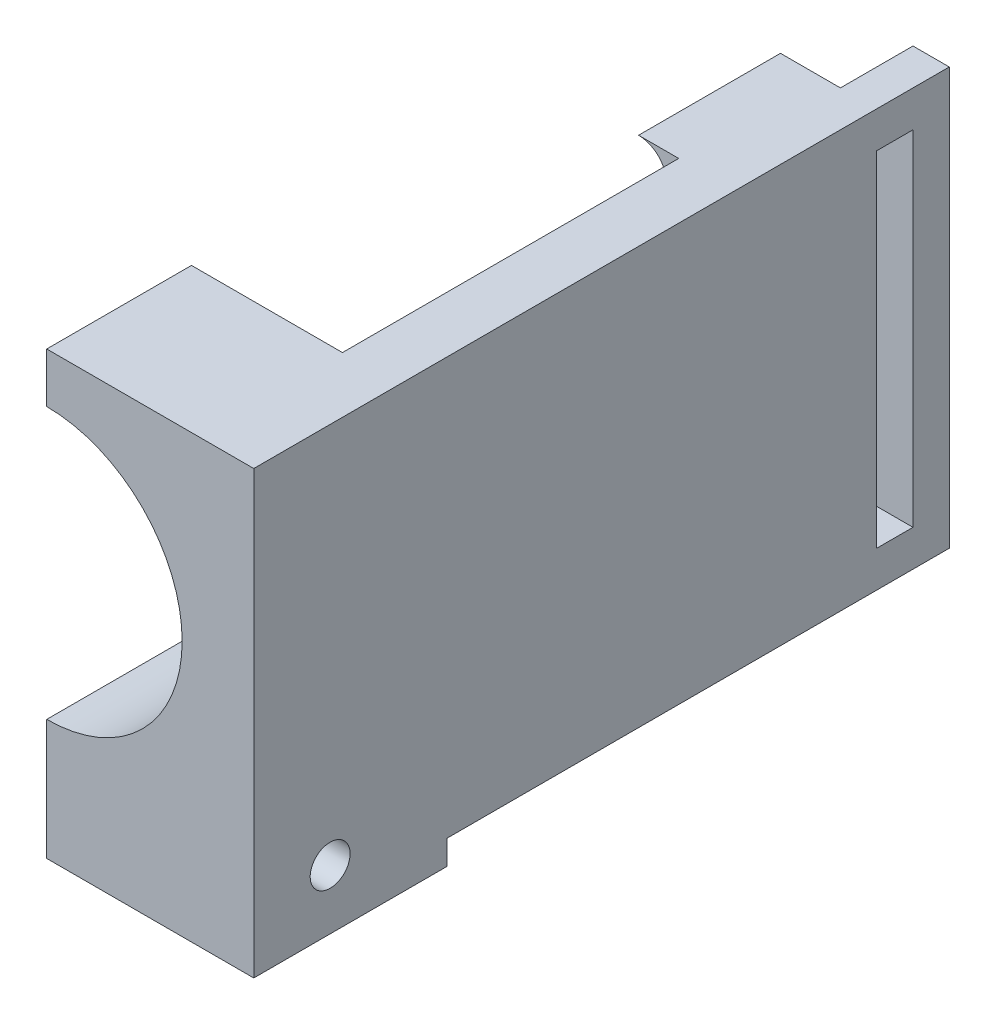
ISO-10303-21;
HEADER;
FILE_DESCRIPTION(('STEP AP214'),'2;1');
FILE_NAME('part.step','',(''),(''),'','','');
FILE_SCHEMA(('AUTOMOTIVE_DESIGN { 1 0 10303 214 1 1 1 1 }'));
ENDSEC;
DATA;
#1=APPLICATION_CONTEXT('core data for automotive mechanical design processes');
#2=APPLICATION_PROTOCOL_DEFINITION('international standard','automotive_design',2000,#1);
#3=PRODUCT_CONTEXT('',#1,'mechanical');
#4=PRODUCT('Part','Part','',(#3));
#5=PRODUCT_RELATED_PRODUCT_CATEGORY('part','',(#4));
#6=PRODUCT_DEFINITION_FORMATION('','',#4);
#7=PRODUCT_DEFINITION_CONTEXT('part definition',#1,'design');
#8=PRODUCT_DEFINITION('design','',#6,#7);
#9=PRODUCT_DEFINITION_SHAPE('','',#8);
#10=(LENGTH_UNIT() NAMED_UNIT(*) SI_UNIT(.MILLI.,.METRE.));
#11=(NAMED_UNIT(*) PLANE_ANGLE_UNIT() SI_UNIT($,.RADIAN.));
#12=(NAMED_UNIT(*) SI_UNIT($,.STERADIAN.) SOLID_ANGLE_UNIT());
#13=UNCERTAINTY_MEASURE_WITH_UNIT(LENGTH_MEASURE(1.E-05),#10,'distance_accuracy_value','');
#14=(GEOMETRIC_REPRESENTATION_CONTEXT(3) GLOBAL_UNCERTAINTY_ASSIGNED_CONTEXT((#13)) GLOBAL_UNIT_ASSIGNED_CONTEXT((#10,
#11,#12)) REPRESENTATION_CONTEXT('',''));
#15=CARTESIAN_POINT('',(0.,0.,0.));
#16=DIRECTION('',(0.,0.,1.));
#17=DIRECTION('',(1.,0.,0.));
#18=AXIS2_PLACEMENT_3D('',#15,#16,#17);
#19=CARTESIAN_POINT('',(-460.160074353057,126.931811763947,51.5000000000002));
#20=DIRECTION('',(1.,1.65860032904852E-13,0.));
#21=DIRECTION('',(0.,-1.17286680793131E-13,1.));
#22=AXIS2_PLACEMENT_3D('',#19,#20,#21);
#23=PLANE('',#22);
#24=CARTESIAN_POINT('',(-460.160074353052,95.3693467112426,45.1869886502198));
#25=DIRECTION('',(-1.,0.,0.));
#26=DIRECTION('',(0.,0.,1.));
#27=AXIS2_PLACEMENT_3D('',#24,#25,#26);
#28=CIRCLE('',#27,1.64999999999998);
#29=CARTESIAN_POINT('',(-460.160074353052,95.3693467112426,46.8369886502197));
#30=VERTEX_POINT('',#29);
#31=EDGE_CURVE('E261',#30,#30,#28,.T.);
#32=ORIENTED_EDGE('',*,*,#31,.T.);
#33=EDGE_LOOP('',(#32));
#34=FACE_BOUND('',#33,.T.);
#35=DIRECTION('',(0.,0.,-1.));
#36=VECTOR('',#35,1.);
#37=CARTESIAN_POINT('',(-460.160074353057,126.931811763947,51.5000000000002));
#38=LINE('',#37,#36);
#39=CARTESIAN_POINT('',(-460.160074353057,126.931811763947,51.5000000000002));
#40=VERTEX_POINT('',#39);
#41=CARTESIAN_POINT('',(-460.160074353057,126.931811763947,-6.));
#42=VERTEX_POINT('',#41);
#43=EDGE_CURVE('E597',#40,#42,#38,.T.);
#44=ORIENTED_EDGE('',*,*,#43,.F.);
#45=DIRECTION('',(-1.65860032904852E-13,1.,0.));
#46=VECTOR('',#45,1.);
#47=CARTESIAN_POINT('',(-460.160074353057,126.931811763947,51.5000000000002));
#48=LINE('',#47,#46);
#49=CARTESIAN_POINT('',(-460.160074353051,90.4528022039471,51.5000000000002));
#50=VERTEX_POINT('',#49);
#51=EDGE_CURVE('E602',#50,#40,#48,.T.);
#52=ORIENTED_EDGE('',*,*,#51,.F.);
#53=DIRECTION('',(0.,0.,-1.));
#54=VECTOR('',#53,1.);
#55=CARTESIAN_POINT('',(-460.160074353051,90.4528022039471,51.5000000000002));
#56=LINE('',#55,#54);
#57=CARTESIAN_POINT('',(-460.160074353051,90.4528022039471,35.5299999999876));
#58=VERTEX_POINT('',#57);
#59=EDGE_CURVE('E591',#50,#58,#56,.T.);
#60=ORIENTED_EDGE('',*,*,#59,.T.);
#61=DIRECTION('',(1.65860032904852E-13,-1.,0.));
#62=VECTOR('',#61,1.);
#63=CARTESIAN_POINT('',(-460.160074353057,126.931811763947,35.5299999999876));
#64=LINE('',#63,#62);
#65=CARTESIAN_POINT('',(-460.160074353052,92.4707569211926,35.5299999999876));
#66=VERTEX_POINT('',#65);
#67=EDGE_CURVE('E278',#66,#58,#64,.T.);
#68=ORIENTED_EDGE('',*,*,#67,.F.);
#69=DIRECTION('',(0.,0.,1.));
#70=VECTOR('',#69,1.);
#71=CARTESIAN_POINT('',(-460.160074353052,92.4707569211926,51.5000000000002));
#72=LINE('',#71,#70);
#73=CARTESIAN_POINT('',(-460.160074353057,92.4707569211926,-6.));
#74=VERTEX_POINT('',#73);
#75=EDGE_CURVE('E283',#74,#66,#72,.T.);
#76=ORIENTED_EDGE('',*,*,#75,.F.);
#77=DIRECTION('',(0.,-1.,0.));
#78=VECTOR('',#77,1.);
#79=CARTESIAN_POINT('',(-460.160074353057,126.931811763947,-6.));
#80=LINE('',#79,#78);
#81=EDGE_CURVE('E249',#42,#74,#80,.T.);
#82=ORIENTED_EDGE('',*,*,#81,.F.);
#83=EDGE_LOOP('',(#44,#52,#60,#68,#76,#82));
#84=FACE_BOUND('',#83,.T.);
#85=DIRECTION('',(1.65860032904852E-13,-1.,0.));
#86=VECTOR('',#85,1.);
#87=CARTESIAN_POINT('',(-460.160074353057,126.931811763947,-3.00000000000014));
#88=LINE('',#87,#86);
#89=CARTESIAN_POINT('',(-460.160074353055,123.931811763953,-3.00000000000013));
#90=VERTEX_POINT('',#89);
#91=CARTESIAN_POINT('',(-460.160074353052,95.4707569211974,-3.00000000000011));
#92=VERTEX_POINT('',#91);
#93=EDGE_CURVE('E226',#90,#92,#88,.T.);
#94=ORIENTED_EDGE('',*,*,#93,.T.);
#95=DIRECTION('',(0.,0.,1.));
#96=VECTOR('',#95,1.);
#97=CARTESIAN_POINT('',(-460.160074353052,95.4707569211984,51.5000000000002));
#98=LINE('',#97,#96);
#99=CARTESIAN_POINT('',(-460.160074353055,95.4707569211984,0.));
#100=VERTEX_POINT('',#99);
#101=EDGE_CURVE('E244',#92,#100,#98,.T.);
#102=ORIENTED_EDGE('',*,*,#101,.T.);
#103=DIRECTION('',(-1.65860032904852E-13,1.,0.));
#104=VECTOR('',#103,1.);
#105=CARTESIAN_POINT('',(-460.160074353057,126.931811763947,0.));
#106=LINE('',#105,#104);
#107=CARTESIAN_POINT('',(-460.160074353057,123.931811763953,0.));
#108=VERTEX_POINT('',#107);
#109=EDGE_CURVE('E242',#100,#108,#106,.T.);
#110=ORIENTED_EDGE('',*,*,#109,.T.);
#111=DIRECTION('',(0.,0.,-1.));
#112=VECTOR('',#111,1.);
#113=CARTESIAN_POINT('',(-460.160074353057,123.931811763953,51.5000000000002));
#114=LINE('',#113,#112);
#115=EDGE_CURVE('E231',#108,#90,#114,.T.);
#116=ORIENTED_EDGE('',*,*,#115,.T.);
#117=EDGE_LOOP('',(#94,#102,#110,#116));
#118=FACE_BOUND('',#117,.T.);
#119=ADVANCED_FACE('F33',(#34,#84,#118),#23,.T.);
#120=CARTESIAN_POINT('',(-463.160074353057,126.931811763947,-3.));
#121=DIRECTION('',(1.,0.,0.));
#122=DIRECTION('',(0.,0.,1.));
#123=AXIS2_PLACEMENT_3D('',#120,#121,#122);
#124=PLANE('',#123);
#125=DIRECTION('',(0.,0.,1.));
#126=VECTOR('',#125,1.);
#127=CARTESIAN_POINT('',(-463.160074353057,95.4707569211974,-2.99999999999997));
#128=LINE('',#127,#126);
#129=CARTESIAN_POINT('',(-463.160074353057,95.4707569211974,-3.0000000000001));
#130=VERTEX_POINT('',#129);
#131=CARTESIAN_POINT('',(-463.160074353057,95.4707569211974,0.));
#132=VERTEX_POINT('',#131);
#133=EDGE_CURVE('E11',#130,#132,#128,.T.);
#134=ORIENTED_EDGE('',*,*,#133,.F.);
#135=DIRECTION('',(0.,-1.,0.));
#136=VECTOR('',#135,1.);
#137=CARTESIAN_POINT('',(-463.160074353057,126.931811763947,-3.00000000000012));
#138=LINE('',#137,#136);
#139=CARTESIAN_POINT('',(-463.160074353057,123.931811763953,-3.00000000000012));
#140=VERTEX_POINT('',#139);
#141=EDGE_CURVE('E624',#140,#130,#138,.T.);
#142=ORIENTED_EDGE('',*,*,#141,.F.);
#143=DIRECTION('',(0.,0.,-1.));
#144=VECTOR('',#143,1.);
#145=CARTESIAN_POINT('',(-463.160074353057,123.931811763952,-3.));
#146=LINE('',#145,#144);
#147=CARTESIAN_POINT('',(-463.160074353057,123.931811763952,0.));
#148=VERTEX_POINT('',#147);
#149=EDGE_CURVE('E41',#148,#140,#146,.T.);
#150=ORIENTED_EDGE('',*,*,#149,.F.);
#151=DIRECTION('',(0.,-1.,0.));
#152=VECTOR('',#151,1.);
#153=CARTESIAN_POINT('',(-463.160074353057,126.931811763947,0.));
#154=LINE('',#153,#152);
#155=CARTESIAN_POINT('',(-463.160074353057,126.931811763947,0.));
#156=VERTEX_POINT('',#155);
#157=EDGE_CURVE('E268',#156,#148,#154,.T.);
#158=ORIENTED_EDGE('',*,*,#157,.F.);
#159=DIRECTION('',(0.,0.,1.));
#160=VECTOR('',#159,1.);
#161=CARTESIAN_POINT('',(-463.160074353057,126.931811763947,-3.));
#162=LINE('',#161,#160);
#163=CARTESIAN_POINT('',(-463.160074353057,126.931811763947,-6.));
#164=VERTEX_POINT('',#163);
#165=EDGE_CURVE('E274',#164,#156,#162,.T.);
#166=ORIENTED_EDGE('',*,*,#165,.F.);
#167=DIRECTION('',(0.,1.,0.));
#168=VECTOR('',#167,1.);
#169=CARTESIAN_POINT('',(-463.160074353057,126.931811763947,-6.));
#170=LINE('',#169,#168);
#171=CARTESIAN_POINT('',(-463.160074353057,92.4707569211926,-6.));
#172=VERTEX_POINT('',#171);
#173=EDGE_CURVE('E255',#172,#164,#170,.T.);
#174=ORIENTED_EDGE('',*,*,#173,.F.);
#175=DIRECTION('',(0.,0.,1.));
#176=VECTOR('',#175,1.);
#177=CARTESIAN_POINT('',(-463.160074353057,92.4707569211926,-3.));
#178=LINE('',#177,#176);
#179=CARTESIAN_POINT('',(-463.160074353057,92.4707569211926,0.));
#180=VERTEX_POINT('',#179);
#181=EDGE_CURVE('E271',#172,#180,#178,.T.);
#182=ORIENTED_EDGE('',*,*,#181,.T.);
#183=EDGE_CURVE('E267',#132,#180,#154,.T.);
#184=ORIENTED_EDGE('',*,*,#183,.F.);
#185=EDGE_LOOP('',(#134,#142,#150,#158,#166,#174,#182,#184));
#186=FACE_BOUND('',#185,.T.);
#187=ADVANCED_FACE('F566',(#186),#124,.F.);
#188=CARTESIAN_POINT('',(-477.276554498702,90.4528022039443,51.5000000000002));
#189=DIRECTION('',(1.66137197891333E-13,-1.,0.));
#190=DIRECTION('',(0.707106781186546,1.17364610913999E-13,0.707106781186549));
#191=AXIS2_PLACEMENT_3D('',#188,#189,#190);
#192=PLANE('',#191);
#193=ORIENTED_EDGE('',*,*,#59,.F.);
#194=DIRECTION('',(1.,1.66137197891333E-13,0.));
#195=VECTOR('',#194,1.);
#196=CARTESIAN_POINT('',(-477.276554498702,90.4528022039443,51.5000000000002));
#197=LINE('',#196,#195);
#198=CARTESIAN_POINT('',(-477.276554498702,90.4528022039443,51.5000000000002));
#199=VERTEX_POINT('',#198);
#200=EDGE_CURVE('E594',#199,#50,#197,.T.);
#201=ORIENTED_EDGE('',*,*,#200,.F.);
#202=DIRECTION('',(0.,0.,-1.));
#203=VECTOR('',#202,1.);
#204=CARTESIAN_POINT('',(-477.276554498702,90.4528022039443,51.5000000000002));
#205=LINE('',#204,#203);
#206=CARTESIAN_POINT('',(-477.276554498703,90.4528022039452,35.5299999999983));
#207=VERTEX_POINT('',#206);
#208=EDGE_CURVE('E598',#199,#207,#205,.T.);
#209=ORIENTED_EDGE('',*,*,#208,.T.);
#210=DIRECTION('',(1.,1.66137197891333E-13,0.));
#211=VECTOR('',#210,1.);
#212=CARTESIAN_POINT('',(-477.276554498702,90.4528022039443,35.5299999999983));
#213=LINE('',#212,#211);
#214=EDGE_CURVE('E294',#207,#58,#213,.T.);
#215=ORIENTED_EDGE('',*,*,#214,.T.);
#216=EDGE_LOOP('',(#193,#201,#209,#215));
#217=FACE_BOUND('',#216,.T.);
#218=ADVANCED_FACE('F573',(#217),#192,.T.);
#219=CARTESIAN_POINT('',(-385.596308409067,-6.39582483758597E-11,0.));
#220=DIRECTION('',(0.,0.,-1.));
#221=DIRECTION('',(1.,0.,0.));
#222=AXIS2_PLACEMENT_3D('',#219,#220,#221);
#223=PLANE('',#222);
#224=CARTESIAN_POINT('',(-468.114796031957,126.931807047554,2.5951463200613E-12));
#225=CARTESIAN_POINT('',(-467.496068248431,126.932089161988,2.70616862252382E-12));
#226=CARTESIAN_POINT('',(-466.889577014183,126.677335876202,2.5951463200613E-12));
#227=CARTESIAN_POINT('',(-466.242380773724,126.028677898943,2.5951463200613E-12));
#228=CARTESIAN_POINT('',(-466.06872842055,125.768815773081,2.5951463200613E-12));
#229=CARTESIAN_POINT('',(-465.834017886216,125.201572162842,2.48412401759879E-12));
#230=CARTESIAN_POINT('',(-465.774089850333,124.897845916206,2.48412401759879E-12));
#231=CARTESIAN_POINT('',(-465.773877511361,124.588570288248,2.37310171513627E-12));
#232=B_SPLINE_CURVE_WITH_KNOTS('',3,(#224,#225,#226,#227,#228,#229,#230,#231),.UNSPECIFIED.,.F.,
.F.,(4,2,2,4),(0.,0.500000000000003,0.750000000000002,1.),.UNSPECIFIED.);
#233=CARTESIAN_POINT('',(-465.773877511361,124.588570288248,2.33146835171283E-12));
#234=VERTEX_POINT('',#233);
#235=CARTESIAN_POINT('',(-468.114796033842,126.931811073181,2.66453525910038E-12));
#236=VERTEX_POINT('',#235);
#237=EDGE_CURVE('E399',#234,#236,#232,.F.);
#238=ORIENTED_EDGE('',*,*,#237,.T.);
#239=DIRECTION('',(-1.,-1.65326412748026E-13,0.));
#240=VECTOR('',#239,1.);
#241=CARTESIAN_POINT('',(-477.276554498709,126.931811763944,1.11022302462516E-13));
#242=LINE('',#241,#240);
#243=EDGE_CURVE('E617',#156,#236,#242,.T.);
#244=ORIENTED_EDGE('',*,*,#243,.F.);
#245=ORIENTED_EDGE('',*,*,#157,.T.);
#246=DIRECTION('',(-1.,-3.31512595153072E-13,0.));
#247=VECTOR('',#246,1.);
#248=CARTESIAN_POINT('',(-460.143034644359,123.931811763953,0.));
#249=LINE('',#248,#247);
#250=EDGE_CURVE('E239',#108,#148,#249,.T.);
#251=ORIENTED_EDGE('',*,*,#250,.F.);
#252=ORIENTED_EDGE('',*,*,#109,.F.);
#253=DIRECTION('',(-1.,-3.31512595153072E-13,0.));
#254=VECTOR('',#253,1.);
#255=CARTESIAN_POINT('',(-460.143034644349,95.4707569211984,0.));
#256=LINE('',#255,#254);
#257=EDGE_CURVE('E232',#100,#132,#256,.T.);
#258=ORIENTED_EDGE('',*,*,#257,.T.);
#259=ORIENTED_EDGE('',*,*,#183,.T.);
#260=DIRECTION('',(1.,0.,0.));
#261=VECTOR('',#260,1.);
#262=CARTESIAN_POINT('',(-385.596308409067,92.4707569211926,0.));
#263=LINE('',#262,#261);
#264=CARTESIAN_POINT('',(-465.773934445629,92.4707569211926,-1.68136313739523E-12));
#265=VERTEX_POINT('',#264);
#266=EDGE_CURVE('E281',#265,#180,#263,.T.);
#267=ORIENTED_EDGE('',*,*,#266,.F.);
#268=DIRECTION('',(4.88753547251991E-06,0.999999999988056,1.20051202729928E-13));
#269=VECTOR('',#268,1.);
#270=CARTESIAN_POINT('',(-465.773934445629,92.4707569211975,-1.4432899320127E-12));
#271=LINE('',#270,#269);
#272=CARTESIAN_POINT('',(-465.773875573204,104.516178530985,1.11022302462516E-13));
#273=VERTEX_POINT('',#272);
#274=EDGE_CURVE('E390',#265,#273,#271,.T.);
#275=ORIENTED_EDGE('',*,*,#274,.T.);
#276=CARTESIAN_POINT('',(-465.56864967198,105.332450282229,1.31838984174237E-13));
#277=CARTESIAN_POINT('',(-465.70324918756,105.082078518386,0.));
#278=CARTESIAN_POINT('',(-465.774208517554,104.800492867988,1.31838984174237E-13));
#279=CARTESIAN_POINT('',(-465.773875573204,104.516178530985,1.31838984174237E-13));
#280=B_SPLINE_CURVE_WITH_KNOTS('',3,(#276,#277,#278,#279),.UNSPECIFIED.,.F.,.F.,(4,4),(0.,
0.999999867875692),.UNSPECIFIED.);
#281=CARTESIAN_POINT('',(-465.568651340804,105.33245105015,2.22044604925031E-13));
#282=VERTEX_POINT('',#281);
#283=EDGE_CURVE('E349',#273,#282,#280,.F.);
#284=ORIENTED_EDGE('',*,*,#283,.T.);
#285=CARTESIAN_POINT('',(-477.278580840851,111.609532937297,8.88178419700125E-13));
#286=DIRECTION('',(0.,-1.17977477392766E-13,1.));
#287=DIRECTION('',(1.,0.,0.));
#288=AXIS2_PLACEMENT_3D('',#285,#286,#287);
#289=CIRCLE('',#288,13.2862412259458);
#290=CARTESIAN_POINT('',(-465.569102668922,117.88745465771,1.66533453693773E-12));
#291=VERTEX_POINT('',#290);
#292=EDGE_CURVE('E446',#282,#291,#289,.T.);
#293=ORIENTED_EDGE('',*,*,#292,.T.);
#294=CARTESIAN_POINT('',(-465.773872780228,118.703841708333,1.67227343084164E-12));
#295=CARTESIAN_POINT('',(-465.774215138043,118.419582861066,1.56125112837913E-12));
#296=CARTESIAN_POINT('',(-465.703720404201,118.137880252078,1.67227343084164E-12));
#297=CARTESIAN_POINT('',(-465.569102668922,117.88745465771,1.67227343084164E-12));
#298=B_SPLINE_CURVE_WITH_KNOTS('',3,(#294,#295,#296,#297),.UNSPECIFIED.,.F.,.F.,(4,4),(0.,
0.999999910707361),.UNSPECIFIED.);
#299=CARTESIAN_POINT('',(-465.773873365884,118.703841632796,1.66533453693773E-12));
#300=VERTEX_POINT('',#299);
#301=EDGE_CURVE('E410',#291,#300,#298,.F.);
#302=ORIENTED_EDGE('',*,*,#301,.T.);
#303=DIRECTION('',(-7.04446682593713E-07,0.999999999999752,1.11628015828976E-13));
#304=VECTOR('',#303,1.);
#305=CARTESIAN_POINT('',(-465.773873365884,118.703841632796,1.66533453693773E-12));
#306=LINE('',#305,#304);
#307=CARTESIAN_POINT('',(-465.773874091199,119.733466311507,5.55111512312578E-13));
#308=VERTEX_POINT('',#307);
#309=EDGE_CURVE('E409',#300,#308,#306,.T.);
#310=ORIENTED_EDGE('',*,*,#309,.T.);
#311=DIRECTION('',(-1.,-1.66000787408614E-13,0.));
#312=VECTOR('',#311,1.);
#313=CARTESIAN_POINT('',(-464.297413987431,119.733466311507,4.44089209850063E-13));
#314=LINE('',#313,#312);
#315=CARTESIAN_POINT('',(-464.297413987431,119.733466311507,4.44089209850063E-13));
#316=VERTEX_POINT('',#315);
#317=EDGE_CURVE('E335',#316,#308,#314,.T.);
#318=ORIENTED_EDGE('',*,*,#317,.F.);
#319=DIRECTION('',(-1.66000787408614E-13,1.,0.));
#320=VECTOR('',#319,1.);
#321=CARTESIAN_POINT('',(-464.297413987431,119.733466311507,4.44089209850063E-13));
#322=LINE('',#321,#320);
#323=CARTESIAN_POINT('',(-464.297413987432,122.933466311507,0.));
#324=VERTEX_POINT('',#323);
#325=EDGE_CURVE('E343',#316,#324,#322,.T.);
#326=ORIENTED_EDGE('',*,*,#325,.T.);
#327=DIRECTION('',(-1.,-1.66000787408614E-13,0.));
#328=VECTOR('',#327,1.);
#329=CARTESIAN_POINT('',(-490.297413987432,122.933466311503,5.55111512312578E-13));
#330=LINE('',#329,#328);
#331=CARTESIAN_POINT('',(-465.773876345429,122.933466311507,4.44089209850063E-13));
#332=VERTEX_POINT('',#331);
#333=EDGE_CURVE('E319',#324,#332,#330,.T.);
#334=ORIENTED_EDGE('',*,*,#333,.T.);
#335=EDGE_CURVE('E405',#332,#234,#306,.T.);
#336=ORIENTED_EDGE('',*,*,#335,.T.);
#337=EDGE_LOOP('',(#238,#244,#245,#251,#252,#258,#259,#267,#275,#284,#293,#302,#310,#318,#326,
#334,#336));
#338=FACE_BOUND('',#337,.T.);
#339=ADVANCED_FACE('F580',(#338),#223,.T.);
#340=CARTESIAN_POINT('',(-465.773873365884,118.703841632792,39.5331100000017));
#341=DIRECTION('',(0.999999999999752,7.04446682593713E-07,0.));
#342=DIRECTION('',(0.,-1.17286680793131E-13,1.));
#343=AXIS2_PLACEMENT_3D('',#340,#341,#342);
#344=PLANE('',#343);
#345=DIRECTION('',(0.,0.,-1.));
#346=VECTOR('',#345,1.);
#347=CARTESIAN_POINT('',(-465.773875639816,121.931811763946,39.5331100000017));
#348=LINE('',#347,#346);
#349=CARTESIAN_POINT('',(-465.773875639816,121.931811763946,39.5331100000027));
#350=VERTEX_POINT('',#349);
#351=CARTESIAN_POINT('',(-465.773875394426,121.931811763946,13.0000000000004));
#352=VERTEX_POINT('',#351);
#353=EDGE_CURVE('E316',#350,#352,#348,.T.);
#354=ORIENTED_EDGE('',*,*,#353,.T.);
#355=DIRECTION('',(7.04446682593713E-07,-0.999999999999752,0.));
#356=VECTOR('',#355,1.);
#357=CARTESIAN_POINT('',(-465.773873365884,118.703841632792,13.0000000000005));
#358=LINE('',#357,#356);
#359=CARTESIAN_POINT('',(-465.773874091199,119.733466311507,13.0000000000005));
#360=VERTEX_POINT('',#359);
#361=EDGE_CURVE('E352',#352,#360,#358,.T.);
#362=ORIENTED_EDGE('',*,*,#361,.T.);
#363=DIRECTION('',(0.,0.,1.));
#364=VECTOR('',#363,1.);
#365=CARTESIAN_POINT('',(-465.773874091199,119.733466311507,39.5331100000018));
#366=LINE('',#365,#364);
#367=EDGE_CURVE('E346',#308,#360,#366,.T.);
#368=ORIENTED_EDGE('',*,*,#367,.F.);
#369=ORIENTED_EDGE('',*,*,#309,.F.);
#370=DIRECTION('',(0.,1.17977477392766E-13,-1.));
#371=VECTOR('',#370,1.);
#372=CARTESIAN_POINT('',(-465.773873365884,118.703841632792,39.5331100000017));
#373=LINE('',#372,#371);
#374=CARTESIAN_POINT('',(-465.773873365884,118.703841632792,39.5331100000017));
#375=VERTEX_POINT('',#374);
#376=EDGE_CURVE('E473',#375,#300,#373,.T.);
#377=ORIENTED_EDGE('',*,*,#376,.F.);
#378=DIRECTION('',(-7.04446682593713E-07,0.999999999999752,1.11628015828976E-13));
#379=VECTOR('',#378,1.);
#380=CARTESIAN_POINT('',(-465.773873365884,118.703841632792,39.5331100000017));
#381=LINE('',#380,#379);
#382=EDGE_CURVE('E466',#375,#350,#381,.T.);
#383=ORIENTED_EDGE('',*,*,#382,.T.);
#384=EDGE_LOOP('',(#354,#362,#368,#369,#377,#383));
#385=FACE_BOUND('',#384,.T.);
#386=ADVANCED_FACE('F586',(#385),#344,.F.);
#387=CARTESIAN_POINT('',(-477.276554498708,126.931811763944,51.5000000000002));
#388=DIRECTION('',(-1.,-1.65860032904852E-13,0.));
#389=DIRECTION('',(0.,1.17286680793131E-13,-1.));
#390=AXIS2_PLACEMENT_3D('',#387,#388,#389);
#391=PLANE('',#390);
#392=DIRECTION('',(0.,0.,-1.));
#393=VECTOR('',#392,1.);
#394=CARTESIAN_POINT('',(-477.276554498708,122.80775275393,90.4341100000001));
#395=LINE('',#394,#393);
#396=CARTESIAN_POINT('',(-477.276554498708,122.80775275393,51.5));
#397=VERTEX_POINT('',#396);
#398=CARTESIAN_POINT('',(-477.276554498708,122.80775275393,39.5331100000001));
#399=VERTEX_POINT('',#398);
#400=EDGE_CURVE('E908',#397,#399,#395,.T.);
#401=ORIENTED_EDGE('',*,*,#400,.F.);
#402=DIRECTION('',(1.65860032904852E-13,-1.,0.));
#403=VECTOR('',#402,1.);
#404=CARTESIAN_POINT('',(-477.276554498708,126.931811763944,51.5000000000002));
#405=LINE('',#404,#403);
#406=CARTESIAN_POINT('',(-477.276554498708,126.931811763944,51.5000000000002));
#407=VERTEX_POINT('',#406);
#408=EDGE_CURVE('E608',#407,#397,#405,.T.);
#409=ORIENTED_EDGE('',*,*,#408,.F.);
#410=DIRECTION('',(0.,0.,-1.));
#411=VECTOR('',#410,1.);
#412=CARTESIAN_POINT('',(-477.276554498708,126.931811763944,51.5000000000002));
#413=LINE('',#412,#411);
#414=CARTESIAN_POINT('',(-477.276554498708,126.93181176394,39.5331100000027));
#415=VERTEX_POINT('',#414);
#416=EDGE_CURVE('E614',#407,#415,#413,.T.);
#417=ORIENTED_EDGE('',*,*,#416,.T.);
#418=DIRECTION('',(-1.65860032904852E-13,1.,0.));
#419=VECTOR('',#418,1.);
#420=CARTESIAN_POINT('',(-477.276554498708,126.931811763944,39.53311));
#421=LINE('',#420,#419);
#422=EDGE_CURVE('E900',#399,#415,#421,.T.);
#423=ORIENTED_EDGE('',*,*,#422,.F.);
#424=EDGE_LOOP('',(#401,#409,#417,#423));
#425=FACE_BOUND('',#424,.T.);
#426=ADVANCED_FACE('F828',(#425),#391,.T.);
#427=CARTESIAN_POINT('',(-477.276554498708,126.931811763944,51.5000000000002));
#428=DIRECTION('',(-1.65326412748026E-13,1.,0.));
#429=DIRECTION('',(-0.707106781186546,-1.16791299241081E-13,-0.707106781186549));
#430=AXIS2_PLACEMENT_3D('',#427,#428,#429);
#431=PLANE('',#430);
#432=DIRECTION('',(-1.,-1.67202262744753E-13,0.));
#433=VECTOR('',#432,1.);
#434=CARTESIAN_POINT('',(-468.114796033843,126.931811763946,39.5331100000027));
#435=LINE('',#434,#433);
#436=CARTESIAN_POINT('',(-464.794796033843,126.931811763946,39.5331100000027));
#437=VERTEX_POINT('',#436);
#438=CARTESIAN_POINT('',(-468.114796033843,126.931811763946,39.5331100000027));
#439=VERTEX_POINT('',#438);
#440=EDGE_CURVE('E300',#437,#439,#435,.T.);
#441=ORIENTED_EDGE('',*,*,#440,.T.);
#442=DIRECTION('',(-0.999999999999997,7.5396397891137E-08,0.));
#443=VECTOR('',#442,1.);
#444=CARTESIAN_POINT('',(-468.114796033843,126.931811073176,39.5331100000027));
#445=LINE('',#444,#443);
#446=EDGE_CURVE('E519',#439,#415,#445,.T.);
#447=ORIENTED_EDGE('',*,*,#446,.T.);
#448=ORIENTED_EDGE('',*,*,#416,.F.);
#449=DIRECTION('',(-1.,-1.65326412748026E-13,0.));
#450=VECTOR('',#449,1.);
#451=CARTESIAN_POINT('',(-477.276554498708,126.931811763944,51.5000000000002));
#452=LINE('',#451,#450);
#453=EDGE_CURVE('E605',#40,#407,#452,.T.);
#454=ORIENTED_EDGE('',*,*,#453,.F.);
#455=ORIENTED_EDGE('',*,*,#43,.T.);
#456=DIRECTION('',(1.,0.,0.));
#457=VECTOR('',#456,1.);
#458=CARTESIAN_POINT('',(-460.160074353057,126.931811763947,-6.));
#459=LINE('',#458,#457);
#460=EDGE_CURVE('E258',#164,#42,#459,.T.);
#461=ORIENTED_EDGE('',*,*,#460,.F.);
#462=ORIENTED_EDGE('',*,*,#165,.T.);
#463=ORIENTED_EDGE('',*,*,#243,.T.);
#464=DIRECTION('',(0.,1.17977477392766E-13,-1.));
#465=VECTOR('',#464,1.);
#466=CARTESIAN_POINT('',(-468.114796033843,126.931811073176,39.5331100000027));
#467=LINE('',#466,#465);
#468=CARTESIAN_POINT('',(-468.114796033843,126.931811763946,11.7331100000027));
#469=VERTEX_POINT('',#468);
#470=EDGE_CURVE('E479',#469,#236,#467,.T.);
#471=ORIENTED_EDGE('',*,*,#470,.F.);
#472=DIRECTION('',(1.,1.58842149607515E-13,0.));
#473=VECTOR('',#472,1.);
#474=CARTESIAN_POINT('',(-468.114796033843,126.931811763946,11.7331100000027));
#475=LINE('',#474,#473);
#476=CARTESIAN_POINT('',(-464.794796033843,126.931811763946,11.7331100000027));
#477=VERTEX_POINT('',#476);
#478=EDGE_CURVE('E296',#469,#477,#475,.T.);
#479=ORIENTED_EDGE('',*,*,#478,.T.);
#480=DIRECTION('',(0.,0.,1.));
#481=VECTOR('',#480,1.);
#482=CARTESIAN_POINT('',(-464.794796033843,126.931811763946,39.5331100000027));
#483=LINE('',#482,#481);
#484=EDGE_CURVE('E303',#477,#437,#483,.T.);
#485=ORIENTED_EDGE('',*,*,#484,.T.);
#486=EDGE_LOOP('',(#441,#447,#448,#454,#455,#461,#462,#463,#471,#479,#485));
#487=FACE_BOUND('',#486,.T.);
#488=ADVANCED_FACE('F578',(#487),#431,.T.);
#489=CARTESIAN_POINT('',(-477.276554498703,95.3693467112426,45.1869886502198));
#490=DIRECTION('',(1.,1.65860032904852E-13,0.));
#491=DIRECTION('',(1.65860032904852E-13,-1.,0.));
#492=AXIS2_PLACEMENT_3D('',#489,#490,#491);
#493=CIRCLE('',#492,1.64999999999999);
#494=CARTESIAN_POINT('',(-477.276554498703,93.7193467112426,45.1869886502198));
#495=VERTEX_POINT('',#494);
#496=EDGE_CURVE('E264',#495,#495,#493,.T.);
#497=ORIENTED_EDGE('',*,*,#496,.T.);
#498=EDGE_LOOP('',(#497));
#499=FACE_BOUND('',#498,.T.);
#500=DIRECTION('',(0.,1.,1.17977477392766E-13));
#501=VECTOR('',#500,1.);
#502=CARTESIAN_POINT('',(-477.276554498702,80.1307569211926,35.5299999999971));
#503=LINE('',#502,#501);
#504=CARTESIAN_POINT('',(-477.276554498703,92.4707569211926,35.5299999999986));
#505=VERTEX_POINT('',#504);
#506=EDGE_CURVE('E291',#207,#505,#503,.T.);
#507=ORIENTED_EDGE('',*,*,#506,.F.);
#508=ORIENTED_EDGE('',*,*,#208,.F.);
#509=CARTESIAN_POINT('',(-477.276554498704,100.411313120601,51.5));
#510=VERTEX_POINT('',#509);
#511=EDGE_CURVE('E620',#510,#199,#405,.T.);
#512=ORIENTED_EDGE('',*,*,#511,.F.);
#513=DIRECTION('',(0.,0.,-1.));
#514=VECTOR('',#513,1.);
#515=CARTESIAN_POINT('',(-477.276554498704,100.411313120601,90.4341100000001));
#516=LINE('',#515,#514);
#517=CARTESIAN_POINT('',(-477.276554498704,100.411313120601,39.5331100000001));
#518=VERTEX_POINT('',#517);
#519=EDGE_CURVE('E911',#518,#510,#516,.F.);
#520=ORIENTED_EDGE('',*,*,#519,.F.);
#521=CARTESIAN_POINT('',(-477.276554498705,92.4707569211921,39.5331099999986));
#522=VERTEX_POINT('',#521);
#523=EDGE_CURVE('E621',#522,#518,#421,.T.);
#524=ORIENTED_EDGE('',*,*,#523,.F.);
#525=DIRECTION('',(0.,1.17977477392766E-13,-1.));
#526=VECTOR('',#525,1.);
#527=CARTESIAN_POINT('',(-477.276554498703,92.4707569211907,51.4999999999961));
#528=LINE('',#527,#526);
#529=EDGE_CURVE('E404',#522,#505,#528,.T.);
#530=ORIENTED_EDGE('',*,*,#529,.T.);
#531=EDGE_LOOP('',(#507,#508,#512,#520,#524,#530));
#532=FACE_BOUND('',#531,.T.);
#533=ADVANCED_FACE('F35',(#499,#532),#391,.T.);
#534=CARTESIAN_POINT('',(-385.596308409067,-6.39664149056565E-11,51.5));
#535=DIRECTION('',(0.,0.,-1.));
#536=DIRECTION('',(1.,0.,0.));
#537=AXIS2_PLACEMENT_3D('',#534,#535,#536);
#538=PLANE('',#537);
#539=CARTESIAN_POINT('',(-477.278580840852,111.609532937265,51.5));
#540=DIRECTION('',(0.,0.,1.));
#541=DIRECTION('',(1.,0.,0.));
#542=AXIS2_PLACEMENT_3D('',#539,#540,#541);
#543=CIRCLE('',#542,11.19822);
#544=EDGE_CURVE('E635',#397,#510,#543,.F.);
#545=ORIENTED_EDGE('',*,*,#544,.T.);
#546=ORIENTED_EDGE('',*,*,#511,.T.);
#547=ORIENTED_EDGE('',*,*,#200,.T.);
#548=ORIENTED_EDGE('',*,*,#51,.T.);
#549=ORIENTED_EDGE('',*,*,#453,.T.);
#550=ORIENTED_EDGE('',*,*,#408,.T.);
#551=EDGE_LOOP('',(#545,#546,#547,#548,#549,#550));
#552=FACE_BOUND('',#551,.T.);
#553=ADVANCED_FACE('F372',(#552),#538,.F.);
#554=CARTESIAN_POINT('',(-465.773875573204,104.516178530981,39.5331100000001));
#555=CARTESIAN_POINT('',(-465.774208517554,104.800492867983,39.5331100000001));
#556=CARTESIAN_POINT('',(-465.70324918756,105.082078518381,39.53311));
#557=CARTESIAN_POINT('',(-465.56864967198,105.332450282224,39.5331100000001));
#558=B_SPLINE_CURVE_WITH_KNOTS('',3,(#554,#555,#556,#557),.UNSPECIFIED.,.F.,.F.,(4,4),(0.,
0.999999867875692),.UNSPECIFIED.);
#559=DIRECTION('',(0.,1.17977477392766E-13,-1.));
#560=VECTOR('',#559,1.);
#561=SURFACE_OF_LINEAR_EXTRUSION('',#558,#560);
#562=ORIENTED_EDGE('',*,*,#283,.F.);
#563=DIRECTION('',(0.,1.17977477392766E-13,-1.));
#564=VECTOR('',#563,1.);
#565=CARTESIAN_POINT('',(-465.773875573204,104.516178530981,39.5331100000001));
#566=LINE('',#565,#564);
#567=CARTESIAN_POINT('',(-465.773875573204,104.516178530981,39.5331100000001));
#568=VERTEX_POINT('',#567);
#569=EDGE_CURVE('E353',#568,#273,#566,.T.);
#570=ORIENTED_EDGE('',*,*,#569,.F.);
#571=CARTESIAN_POINT('',(-465.773875573204,104.516178530981,39.5331100000001));
#572=CARTESIAN_POINT('',(-465.774208517554,104.800492867983,39.5331100000001));
#573=CARTESIAN_POINT('',(-465.70324918756,105.082078518381,39.53311));
#574=CARTESIAN_POINT('',(-465.56864967198,105.332450282224,39.5331100000001));
#575=B_SPLINE_CURVE_WITH_KNOTS('',3,(#571,#572,#573,#574),.UNSPECIFIED.,.F.,.F.,(4,4),(0.,
0.999999867875692),.UNSPECIFIED.);
#576=CARTESIAN_POINT('',(-465.568651340804,105.332451050145,39.5331100000001));
#577=VERTEX_POINT('',#576);
#578=EDGE_CURVE('E398',#568,#577,#575,.T.);
#579=ORIENTED_EDGE('',*,*,#578,.T.);
#580=DIRECTION('',(0.,1.17977477392766E-13,-1.));
#581=VECTOR('',#580,1.);
#582=CARTESIAN_POINT('',(-465.568651340804,105.332451050145,39.5331100000001));
#583=LINE('',#582,#581);
#584=EDGE_CURVE('E459',#577,#282,#583,.T.);
#585=ORIENTED_EDGE('',*,*,#584,.T.);
#586=EDGE_LOOP('',(#562,#570,#579,#585));
#587=FACE_BOUND('',#586,.T.);
#588=ADVANCED_FACE('F366',(#587),#561,.T.);
#589=CARTESIAN_POINT('',(-465.773934445629,92.4707569211928,39.5331099999986));
#590=DIRECTION('',(0.999999999988056,-4.88753547251991E-06,0.));
#591=DIRECTION('',(0.,-1.17286680793131E-13,1.));
#592=AXIS2_PLACEMENT_3D('',#589,#590,#591);
#593=PLANE('',#592);
#594=ORIENTED_EDGE('',*,*,#274,.F.);
#595=DIRECTION('',(0.,-1.17959243398817E-13,1.));
#596=VECTOR('',#595,1.);
#597=CARTESIAN_POINT('',(-465.773934445629,92.4707569211975,-1.44328993201262E-12));
#598=LINE('',#597,#596);
#599=CARTESIAN_POINT('',(-465.773934445629,92.4707569211933,35.5299999999986));
#600=VERTEX_POINT('',#599);
#601=EDGE_CURVE('E286',#265,#600,#598,.T.);
#602=ORIENTED_EDGE('',*,*,#601,.T.);
#603=DIRECTION('',(0.,1.17977477392766E-13,-1.));
#604=VECTOR('',#603,1.);
#605=CARTESIAN_POINT('',(-465.773934445629,92.4707569211928,39.5331099999986));
#606=LINE('',#605,#604);
#607=CARTESIAN_POINT('',(-465.773934445629,92.4707569211928,39.5331099999986));
#608=VERTEX_POINT('',#607);
#609=EDGE_CURVE('E510',#608,#600,#606,.T.);
#610=ORIENTED_EDGE('',*,*,#609,.F.);
#611=DIRECTION('',(4.88753547251991E-06,0.999999999988056,1.20051202729928E-13));
#612=VECTOR('',#611,1.);
#613=CARTESIAN_POINT('',(-465.773934445629,92.4707569211928,39.5331099999986));
#614=LINE('',#613,#612);
#615=EDGE_CURVE('E481',#608,#568,#614,.T.);
#616=ORIENTED_EDGE('',*,*,#615,.T.);
#617=ORIENTED_EDGE('',*,*,#569,.T.);
#618=EDGE_LOOP('',(#594,#602,#610,#616,#617));
#619=FACE_BOUND('',#618,.T.);
#620=ADVANCED_FACE('F371',(#619),#593,.F.);
#621=CARTESIAN_POINT('',(-488.783227184468,92.4707569211914,39.5331099999986));
#622=DIRECTION('',(0.,-1.,-1.17977477392766E-13));
#623=DIRECTION('',(-0.707106781186549,-1.27176204571094E-13,0.707106781186546));
#624=AXIS2_PLACEMENT_3D('',#621,#622,#623);
#625=PLANE('',#624);
#626=ORIENTED_EDGE('',*,*,#529,.F.);
#627=DIRECTION('',(1.,0.,0.));
#628=VECTOR('',#627,1.);
#629=CARTESIAN_POINT('',(-488.783227184468,92.4707569211914,39.5331099999986));
#630=LINE('',#629,#628);
#631=EDGE_CURVE('E514',#522,#608,#630,.T.);
#632=ORIENTED_EDGE('',*,*,#631,.T.);
#633=ORIENTED_EDGE('',*,*,#609,.T.);
#634=DIRECTION('',(-1.,0.,0.));
#635=VECTOR('',#634,1.);
#636=CARTESIAN_POINT('',(-477.276554498703,92.4707569211926,35.5299999999986));
#637=LINE('',#636,#635);
#638=EDGE_CURVE('E289',#600,#505,#637,.T.);
#639=ORIENTED_EDGE('',*,*,#638,.T.);
#640=EDGE_LOOP('',(#626,#632,#633,#639));
#641=FACE_BOUND('',#640,.T.);
#642=ADVANCED_FACE('F560',(#641),#625,.F.);
#643=CARTESIAN_POINT('',(-465.773877511361,124.588570288244,39.5331100000024));
#644=CARTESIAN_POINT('',(-465.774089850333,124.897845916202,39.5331100000025));
#645=CARTESIAN_POINT('',(-465.834017886216,125.201572162838,39.5331100000025));
#646=CARTESIAN_POINT('',(-466.06872842055,125.768815773076,39.5331100000026));
#647=CARTESIAN_POINT('',(-466.242380773724,126.028677898938,39.5331100000026));
#648=CARTESIAN_POINT('',(-466.889577014183,126.677335876197,39.5331100000026));
#649=CARTESIAN_POINT('',(-467.496068248431,126.932089161983,39.5331100000027));
#650=CARTESIAN_POINT('',(-468.114796031957,126.931807047549,39.5331100000026));
#651=B_SPLINE_CURVE_WITH_KNOTS('',3,(#643,#644,#645,#646,#647,#648,#649,#650),.UNSPECIFIED.,.F.,
.F.,(4,2,2,4),(0.,0.249999999999998,0.499999999999997,1.),.UNSPECIFIED.);
#652=DIRECTION('',(0.,1.17977477392766E-13,-1.));
#653=VECTOR('',#652,1.);
#654=SURFACE_OF_LINEAR_EXTRUSION('',#651,#653);
#655=ORIENTED_EDGE('',*,*,#470,.T.);
#656=ORIENTED_EDGE('',*,*,#237,.F.);
#657=DIRECTION('',(0.,1.17977477392766E-13,-1.));
#658=VECTOR('',#657,1.);
#659=CARTESIAN_POINT('',(-465.773877511361,124.588570288244,39.5331100000024));
#660=LINE('',#659,#658);
#661=CARTESIAN_POINT('',(-465.773877511361,124.588570288247,11.7331100000027));
#662=VERTEX_POINT('',#661);
#663=EDGE_CURVE('E474',#662,#234,#660,.T.);
#664=ORIENTED_EDGE('',*,*,#663,.F.);
#665=CARTESIAN_POINT('',(-465.773877511361,124.588570288247,11.733110000003));
#666=CARTESIAN_POINT('',(-465.774089850333,124.897845916205,11.7331100000031));
#667=CARTESIAN_POINT('',(-465.834017886216,125.201572162841,11.7331100000031));
#668=CARTESIAN_POINT('',(-466.06872842055,125.768815773079,11.7331100000032));
#669=CARTESIAN_POINT('',(-466.242380773724,126.028677898942,11.7331100000032));
#670=CARTESIAN_POINT('',(-466.889577014183,126.6773358762,11.7331100000032));
#671=CARTESIAN_POINT('',(-467.496068248431,126.932089161986,11.7331100000033));
#672=CARTESIAN_POINT('',(-468.114796031957,126.931807047552,11.7331100000032));
#673=B_SPLINE_CURVE_WITH_KNOTS('',3,(#665,#666,#667,#668,#669,#670,#671,#672),.UNSPECIFIED.,.F.,
.F.,(4,2,2,4),(0.,0.249999999999998,0.499999999999997,1.),.UNSPECIFIED.);
#674=EDGE_CURVE('E312',#469,#662,#673,.F.);
#675=ORIENTED_EDGE('',*,*,#674,.F.);
#676=EDGE_LOOP('',(#655,#656,#664,#675));
#677=FACE_BOUND('',#676,.T.);
#678=ADVANCED_FACE('F552',(#677),#654,.T.);
#679=ORIENTED_EDGE('',*,*,#663,.T.);
#680=ORIENTED_EDGE('',*,*,#335,.F.);
#681=DIRECTION('',(0.,0.,-1.));
#682=VECTOR('',#681,1.);
#683=CARTESIAN_POINT('',(-465.773876345429,122.933466311507,39.5331100000017));
#684=LINE('',#683,#682);
#685=CARTESIAN_POINT('',(-465.773876345429,122.933466311507,11.7331100000027));
#686=VERTEX_POINT('',#685);
#687=EDGE_CURVE('E331',#686,#332,#684,.T.);
#688=ORIENTED_EDGE('',*,*,#687,.F.);
#689=DIRECTION('',(7.04446682593713E-07,-0.999999999999752,0.));
#690=VECTOR('',#689,1.);
#691=CARTESIAN_POINT('',(-465.773873365884,118.703841632792,11.7331100000027));
#692=LINE('',#691,#690);
#693=EDGE_CURVE('E308',#662,#686,#692,.T.);
#694=ORIENTED_EDGE('',*,*,#693,.F.);
#695=EDGE_LOOP('',(#679,#680,#688,#694));
#696=FACE_BOUND('',#695,.T.);
#697=ADVANCED_FACE('F436',(#696),#344,.F.);
#698=CARTESIAN_POINT('',(-465.569102668922,117.887454657706,39.5331100000017));
#699=CARTESIAN_POINT('',(-465.703720404201,118.137880252073,39.5331100000017));
#700=CARTESIAN_POINT('',(-465.774215138043,118.419582861061,39.5331100000016));
#701=CARTESIAN_POINT('',(-465.773872780228,118.703841708328,39.5331100000017));
#702=B_SPLINE_CURVE_WITH_KNOTS('',3,(#698,#699,#700,#701),.UNSPECIFIED.,.F.,.F.,(4,4),(0.,
0.999999910707361),.UNSPECIFIED.);
#703=DIRECTION('',(0.,1.17977477392766E-13,-1.));
#704=VECTOR('',#703,1.);
#705=SURFACE_OF_LINEAR_EXTRUSION('',#702,#704);
#706=ORIENTED_EDGE('',*,*,#301,.F.);
#707=DIRECTION('',(0.,1.17977477392766E-13,-1.));
#708=VECTOR('',#707,1.);
#709=CARTESIAN_POINT('',(-465.569102668922,117.887454657706,39.5331100000017));
#710=LINE('',#709,#708);
#711=CARTESIAN_POINT('',(-465.569102668922,117.887454657706,39.5331100000017));
#712=VERTEX_POINT('',#711);
#713=EDGE_CURVE('E475',#712,#291,#710,.T.);
#714=ORIENTED_EDGE('',*,*,#713,.F.);
#715=CARTESIAN_POINT('',(-465.569102668922,117.887454657706,39.5331100000017));
#716=CARTESIAN_POINT('',(-465.703720404201,118.137880252073,39.5331100000017));
#717=CARTESIAN_POINT('',(-465.774215138043,118.419582861061,39.5331100000016));
#718=CARTESIAN_POINT('',(-465.773872780228,118.703841708328,39.5331100000017));
#719=B_SPLINE_CURVE_WITH_KNOTS('',3,(#715,#716,#717,#718),.UNSPECIFIED.,.F.,.F.,(4,4),(0.,
0.999999910707361),.UNSPECIFIED.);
#720=EDGE_CURVE('E421',#712,#375,#719,.T.);
#721=ORIENTED_EDGE('',*,*,#720,.T.);
#722=ORIENTED_EDGE('',*,*,#376,.T.);
#723=EDGE_LOOP('',(#706,#714,#721,#722));
#724=FACE_BOUND('',#723,.T.);
#725=ADVANCED_FACE('F427',(#724),#705,.T.);
#726=CARTESIAN_POINT('',(-477.278580840851,111.609532937292,39.5331100000008));
#727=DIRECTION('',(0.,1.17977477392766E-13,-1.));
#728=DIRECTION('',(1.,0.,0.));
#729=AXIS2_PLACEMENT_3D('',#726,#727,#728);
#730=CYLINDRICAL_SURFACE('',#729,13.2862412259458);
#731=ORIENTED_EDGE('',*,*,#292,.F.);
#732=ORIENTED_EDGE('',*,*,#584,.F.);
#733=CARTESIAN_POINT('',(-477.278580840851,111.609532937292,39.5331100000008));
#734=DIRECTION('',(0.,-1.17977477392766E-13,1.));
#735=DIRECTION('',(1.,0.,0.));
#736=AXIS2_PLACEMENT_3D('',#733,#734,#735);
#737=CIRCLE('',#736,13.2862412259458);
#738=EDGE_CURVE('E463',#577,#712,#737,.T.);
#739=ORIENTED_EDGE('',*,*,#738,.T.);
#740=ORIENTED_EDGE('',*,*,#713,.T.);
#741=EDGE_LOOP('',(#731,#732,#739,#740));
#742=FACE_BOUND('',#741,.T.);
#743=ADVANCED_FACE('F374',(#742),#730,.F.);
#744=CARTESIAN_POINT('',(-465.721862295066,104.937042871537,39.53311));
#745=DIRECTION('',(0.,0.,-1.));
#746=DIRECTION('',(1.,0.,0.));
#747=AXIS2_PLACEMENT_3D('',#744,#745,#746);
#748=PLANE('',#747);
#749=ORIENTED_EDGE('',*,*,#440,.F.);
#750=DIRECTION('',(-1.65326412748026E-13,1.,0.));
#751=VECTOR('',#750,1.);
#752=CARTESIAN_POINT('',(-464.794796033842,121.931811763946,39.5331100000027));
#753=LINE('',#752,#751);
#754=CARTESIAN_POINT('',(-464.794796033842,121.931811763946,39.5331100000027));
#755=VERTEX_POINT('',#754);
#756=EDGE_CURVE('E306',#755,#437,#753,.T.);
#757=ORIENTED_EDGE('',*,*,#756,.F.);
#758=DIRECTION('',(-1.,-1.67202262744753E-13,0.));
#759=VECTOR('',#758,1.);
#760=CARTESIAN_POINT('',(-468.114796033842,121.931811763946,39.5331100000027));
#761=LINE('',#760,#759);
#762=EDGE_CURVE('E299',#755,#350,#761,.T.);
#763=ORIENTED_EDGE('',*,*,#762,.T.);
#764=ORIENTED_EDGE('',*,*,#382,.F.);
#765=ORIENTED_EDGE('',*,*,#720,.F.);
#766=ORIENTED_EDGE('',*,*,#738,.F.);
#767=ORIENTED_EDGE('',*,*,#578,.F.);
#768=ORIENTED_EDGE('',*,*,#615,.F.);
#769=ORIENTED_EDGE('',*,*,#631,.F.);
#770=ORIENTED_EDGE('',*,*,#523,.T.);
#771=CARTESIAN_POINT('',(-477.278580840852,111.609532937265,39.5331100000001));
#772=DIRECTION('',(0.,0.,-1.));
#773=DIRECTION('',(-1.,0.,0.));
#774=AXIS2_PLACEMENT_3D('',#771,#772,#773);
#775=CIRCLE('',#774,11.19822);
#776=EDGE_CURVE('E350',#399,#518,#775,.T.);
#777=ORIENTED_EDGE('',*,*,#776,.F.);
#778=ORIENTED_EDGE('',*,*,#422,.T.);
#779=ORIENTED_EDGE('',*,*,#446,.F.);
#780=EDGE_LOOP('',(#749,#757,#763,#764,#765,#766,#767,#768,#769,#770,#777,#778,#779));
#781=FACE_BOUND('',#780,.T.);
#782=ADVANCED_FACE('F486',(#781),#748,.T.);
#783=CARTESIAN_POINT('',(-477.278580840852,111.609532937265,90.4341100000001));
#784=DIRECTION('',(0.,0.,-1.));
#785=DIRECTION('',(1.,0.,0.));
#786=AXIS2_PLACEMENT_3D('',#783,#784,#785);
#787=CYLINDRICAL_SURFACE('',#786,11.19822);
#788=ORIENTED_EDGE('',*,*,#776,.T.);
#789=ORIENTED_EDGE('',*,*,#519,.T.);
#790=ORIENTED_EDGE('',*,*,#544,.F.);
#791=ORIENTED_EDGE('',*,*,#400,.T.);
#792=EDGE_LOOP('',(#788,#789,#790,#791));
#793=FACE_BOUND('',#792,.T.);
#794=ADVANCED_FACE('F496',(#793),#787,.F.);
#795=CARTESIAN_POINT('',(-464.297413987431,119.733466311507,13.0000000000005));
#796=DIRECTION('',(-1.,-1.66000787408614E-13,0.));
#797=DIRECTION('',(0.,1.17286680793131E-13,-1.));
#798=AXIS2_PLACEMENT_3D('',#795,#796,#797);
#799=PLANE('',#798);
#800=DIRECTION('',(-1.66000787408614E-13,1.,0.));
#801=VECTOR('',#800,1.);
#802=CARTESIAN_POINT('',(-464.297413987431,119.733466311507,13.0000000000005));
#803=LINE('',#802,#801);
#804=CARTESIAN_POINT('',(-464.297413987431,119.733466311507,13.0000000000005));
#805=VERTEX_POINT('',#804);
#806=CARTESIAN_POINT('',(-464.297413987432,122.933466311507,13.0000000000005));
#807=VERTEX_POINT('',#806);
#808=EDGE_CURVE('E340',#805,#807,#803,.T.);
#809=ORIENTED_EDGE('',*,*,#808,.T.);
#810=DIRECTION('',(0.,0.,-1.));
#811=VECTOR('',#810,1.);
#812=CARTESIAN_POINT('',(-464.297413987432,122.933466311507,13.0000000000005));
#813=LINE('',#812,#811);
#814=EDGE_CURVE('E327',#807,#324,#813,.T.);
#815=ORIENTED_EDGE('',*,*,#814,.T.);
#816=ORIENTED_EDGE('',*,*,#325,.F.);
#817=DIRECTION('',(0.,0.,-1.));
#818=VECTOR('',#817,1.);
#819=CARTESIAN_POINT('',(-464.297413987431,119.733466311507,13.0000000000005));
#820=LINE('',#819,#818);
#821=EDGE_CURVE('E333',#805,#316,#820,.T.);
#822=ORIENTED_EDGE('',*,*,#821,.F.);
#823=EDGE_LOOP('',(#809,#815,#816,#822));
#824=FACE_BOUND('',#823,.T.);
#825=ADVANCED_FACE('F697',(#824),#799,.T.);
#826=CARTESIAN_POINT('',(-385.596308409087,119.73346631152,545.3155289531));
#827=DIRECTION('',(1.66000787408614E-13,-1.,0.));
#828=DIRECTION('',(0.707106781186546,1.1672495877943E-13,0.707106781186549));
#829=AXIS2_PLACEMENT_3D('',#826,#827,#828);
#830=PLANE('',#829);
#831=ORIENTED_EDGE('',*,*,#317,.T.);
#832=ORIENTED_EDGE('',*,*,#367,.T.);
#833=DIRECTION('',(1.,1.66000787408614E-13,0.));
#834=VECTOR('',#833,1.);
#835=CARTESIAN_POINT('',(-490.297413987431,119.733466311503,13.0000000000005));
#836=LINE('',#835,#834);
#837=EDGE_CURVE('E338',#360,#805,#836,.T.);
#838=ORIENTED_EDGE('',*,*,#837,.T.);
#839=ORIENTED_EDGE('',*,*,#821,.T.);
#840=EDGE_LOOP('',(#831,#832,#838,#839));
#841=FACE_BOUND('',#840,.T.);
#842=ADVANCED_FACE('F706',(#841),#830,.F.);
#843=CARTESIAN_POINT('',(-490.297413987431,119.733466311503,13.0000000000005));
#844=DIRECTION('',(0.,0.,-1.));
#845=DIRECTION('',(1.,0.,0.));
#846=AXIS2_PLACEMENT_3D('',#843,#844,#845);
#847=PLANE('',#846);
#848=DIRECTION('',(-1.65326412748026E-13,1.,0.));
#849=VECTOR('',#848,1.);
#850=CARTESIAN_POINT('',(-464.794796033841,119.733466311507,13.0000000000004));
#851=LINE('',#850,#849);
#852=CARTESIAN_POINT('',(-464.794796033842,121.931811763946,13.0000000000004));
#853=VERTEX_POINT('',#852);
#854=CARTESIAN_POINT('',(-464.794796033842,122.933466311507,13.0000000000005));
#855=VERTEX_POINT('',#854);
#856=EDGE_CURVE('E313',#853,#855,#851,.T.);
#857=ORIENTED_EDGE('',*,*,#856,.T.);
#858=DIRECTION('',(-1.,-1.66000787408614E-13,0.));
#859=VECTOR('',#858,1.);
#860=CARTESIAN_POINT('',(-490.297413987432,122.933466311503,13.0000000000006));
#861=LINE('',#860,#859);
#862=EDGE_CURVE('E324',#807,#855,#861,.T.);
#863=ORIENTED_EDGE('',*,*,#862,.F.);
#864=ORIENTED_EDGE('',*,*,#808,.F.);
#865=ORIENTED_EDGE('',*,*,#837,.F.);
#866=ORIENTED_EDGE('',*,*,#361,.F.);
#867=DIRECTION('',(-1.,-1.58842149607515E-13,0.));
#868=VECTOR('',#867,1.);
#869=CARTESIAN_POINT('',(-490.297413987431,121.931811763942,13.0000000000005));
#870=LINE('',#869,#868);
#871=EDGE_CURVE('E537',#853,#352,#870,.T.);
#872=ORIENTED_EDGE('',*,*,#871,.F.);
#873=EDGE_LOOP('',(#857,#863,#864,#865,#866,#872));
#874=FACE_BOUND('',#873,.T.);
#875=ADVANCED_FACE('F714',(#874),#847,.T.);
#876=CARTESIAN_POINT('',(-490.297413987432,122.933466311503,13.0000000000006));
#877=DIRECTION('',(-1.66000787408614E-13,1.,0.));
#878=DIRECTION('',(-0.707106781186546,-1.17268154136643E-13,-0.707106781186549));
#879=AXIS2_PLACEMENT_3D('',#876,#877,#878);
#880=PLANE('',#879);
#881=DIRECTION('',(1.,1.66000787408614E-13,0.));
#882=VECTOR('',#881,1.);
#883=CARTESIAN_POINT('',(-490.297413987432,122.933466311503,11.7331100000027));
#884=LINE('',#883,#882);
#885=CARTESIAN_POINT('',(-464.794796033842,122.933466311507,11.7331100000027));
#886=VERTEX_POINT('',#885);
#887=EDGE_CURVE('E630',#686,#886,#884,.T.);
#888=ORIENTED_EDGE('',*,*,#887,.F.);
#889=ORIENTED_EDGE('',*,*,#687,.T.);
#890=ORIENTED_EDGE('',*,*,#333,.F.);
#891=ORIENTED_EDGE('',*,*,#814,.F.);
#892=ORIENTED_EDGE('',*,*,#862,.T.);
#893=DIRECTION('',(0.,0.,1.));
#894=VECTOR('',#893,1.);
#895=CARTESIAN_POINT('',(-464.794796033842,122.933466311507,13.0000000000006));
#896=LINE('',#895,#894);
#897=EDGE_CURVE('E625',#886,#855,#896,.T.);
#898=ORIENTED_EDGE('',*,*,#897,.F.);
#899=EDGE_LOOP('',(#888,#889,#890,#891,#892,#898));
#900=FACE_BOUND('',#899,.T.);
#901=ADVANCED_FACE('F725',(#900),#880,.F.);
#902=CARTESIAN_POINT('',(-1.93354897704333E-11,121.93181176402,1.2593610782961E-13));
#903=DIRECTION('',(-1.58842149607515E-13,1.,0.));
#904=DIRECTION('',(-1.,-1.58842149607515E-13,0.));
#905=AXIS2_PLACEMENT_3D('',#902,#903,#904);
#906=PLANE('',#905);
#907=ORIENTED_EDGE('',*,*,#353,.F.);
#908=ORIENTED_EDGE('',*,*,#762,.F.);
#909=DIRECTION('',(0.,0.,1.));
#910=VECTOR('',#909,1.);
#911=CARTESIAN_POINT('',(-464.794796033842,121.931811763946,39.5331100000027));
#912=LINE('',#911,#910);
#913=EDGE_CURVE('E297',#853,#755,#912,.T.);
#914=ORIENTED_EDGE('',*,*,#913,.F.);
#915=ORIENTED_EDGE('',*,*,#871,.T.);
#916=EDGE_LOOP('',(#907,#908,#914,#915));
#917=FACE_BOUND('',#916,.T.);
#918=ADVANCED_FACE('F733',(#917),#906,.T.);
#919=CARTESIAN_POINT('',(-468.114796033842,121.931811763946,11.7331100000027));
#920=DIRECTION('',(0.,0.,-1.));
#921=DIRECTION('',(0.,-1.,0.));
#922=AXIS2_PLACEMENT_3D('',#919,#920,#921);
#923=PLANE('',#922);
#924=ORIENTED_EDGE('',*,*,#478,.F.);
#925=ORIENTED_EDGE('',*,*,#674,.T.);
#926=ORIENTED_EDGE('',*,*,#693,.T.);
#927=ORIENTED_EDGE('',*,*,#887,.T.);
#928=DIRECTION('',(-1.65326412748026E-13,1.,0.));
#929=VECTOR('',#928,1.);
#930=CARTESIAN_POINT('',(-464.794796033842,121.931811763946,11.7331100000027));
#931=LINE('',#930,#929);
#932=EDGE_CURVE('E302',#886,#477,#931,.T.);
#933=ORIENTED_EDGE('',*,*,#932,.T.);
#934=EDGE_LOOP('',(#924,#925,#926,#927,#933));
#935=FACE_BOUND('',#934,.T.);
#936=ADVANCED_FACE('F743',(#935),#923,.F.);
#937=CARTESIAN_POINT('',(-464.794796033842,121.931811763946,39.5331100000027));
#938=DIRECTION('',(1.,1.65326412748026E-13,0.));
#939=DIRECTION('',(-1.65326412748026E-13,1.,0.));
#940=AXIS2_PLACEMENT_3D('',#937,#938,#939);
#941=PLANE('',#940);
#942=ORIENTED_EDGE('',*,*,#856,.F.);
#943=ORIENTED_EDGE('',*,*,#913,.T.);
#944=ORIENTED_EDGE('',*,*,#756,.T.);
#945=ORIENTED_EDGE('',*,*,#484,.F.);
#946=ORIENTED_EDGE('',*,*,#932,.F.);
#947=ORIENTED_EDGE('',*,*,#897,.T.);
#948=EDGE_LOOP('',(#942,#943,#944,#945,#946,#947));
#949=FACE_BOUND('',#948,.T.);
#950=ADVANCED_FACE('F752',(#949),#941,.F.);
#951=CARTESIAN_POINT('',(-477.276554498702,80.1307569211926,35.5299999999971));
#952=DIRECTION('',(0.,-1.17977477392766E-13,1.));
#953=DIRECTION('',(0.,1.,1.17977477392766E-13));
#954=AXIS2_PLACEMENT_3D('',#951,#952,#953);
#955=PLANE('',#954);
#956=ORIENTED_EDGE('',*,*,#214,.F.);
#957=ORIENTED_EDGE('',*,*,#506,.T.);
#958=ORIENTED_EDGE('',*,*,#638,.F.);
#959=DIRECTION('',(-1.,0.,0.));
#960=VECTOR('',#959,1.);
#961=CARTESIAN_POINT('',(-477.276554498703,92.4707569211926,35.5299999999876));
#962=LINE('',#961,#960);
#963=EDGE_CURVE('E276',#66,#600,#962,.T.);
#964=ORIENTED_EDGE('',*,*,#963,.F.);
#965=ORIENTED_EDGE('',*,*,#67,.T.);
#966=EDGE_LOOP('',(#956,#957,#958,#964,#965));
#967=FACE_BOUND('',#966,.T.);
#968=ADVANCED_FACE('F762',(#967),#955,.F.);
#969=CARTESIAN_POINT('',(-477.276554498703,92.4707569211926,-5.81000000001237));
#970=DIRECTION('',(0.,-1.,0.));
#971=DIRECTION('',(0.,0.,1.));
#972=AXIS2_PLACEMENT_3D('',#969,#970,#971);
#973=PLANE('',#972);
#974=ORIENTED_EDGE('',*,*,#266,.T.);
#975=ORIENTED_EDGE('',*,*,#181,.F.);
#976=DIRECTION('',(-1.,0.,0.));
#977=VECTOR('',#976,1.);
#978=CARTESIAN_POINT('',(-460.160074353057,92.4707569211926,-6.));
#979=LINE('',#978,#977);
#980=EDGE_CURVE('E252',#74,#172,#979,.T.);
#981=ORIENTED_EDGE('',*,*,#980,.F.);
#982=ORIENTED_EDGE('',*,*,#75,.T.);
#983=ORIENTED_EDGE('',*,*,#963,.T.);
#984=ORIENTED_EDGE('',*,*,#601,.F.);
#985=EDGE_LOOP('',(#974,#975,#981,#982,#983,#984));
#986=FACE_BOUND('',#985,.T.);
#987=ADVANCED_FACE('F771',(#986),#973,.T.);
#988=CARTESIAN_POINT('',(-460.160074353052,95.3693467112426,45.1869886502198));
#989=DIRECTION('',(1.,0.,0.));
#990=DIRECTION('',(0.,0.,1.));
#991=AXIS2_PLACEMENT_3D('',#988,#989,#990);
#992=CYLINDRICAL_SURFACE('',#991,1.64999999999999);
#993=ORIENTED_EDGE('',*,*,#31,.F.);
#994=EDGE_LOOP('',(#993));
#995=FACE_BOUND('',#994,.T.);
#996=ORIENTED_EDGE('',*,*,#496,.F.);
#997=EDGE_LOOP('',(#996));
#998=FACE_BOUND('',#997,.T.);
#999=ADVANCED_FACE('F779',(#995,#998),#992,.F.);
#1000=CARTESIAN_POINT('',(0.,0.,-6.));
#1001=DIRECTION('',(0.,0.,-1.));
#1002=DIRECTION('',(-1.,0.,0.));
#1003=AXIS2_PLACEMENT_3D('',#1000,#1001,#1002);
#1004=PLANE('',#1003);
#1005=ORIENTED_EDGE('',*,*,#81,.T.);
#1006=ORIENTED_EDGE('',*,*,#980,.T.);
#1007=ORIENTED_EDGE('',*,*,#173,.T.);
#1008=ORIENTED_EDGE('',*,*,#460,.T.);
#1009=EDGE_LOOP('',(#1005,#1006,#1007,#1008));
#1010=FACE_BOUND('',#1009,.T.);
#1011=ADVANCED_FACE('F784',(#1010),#1004,.T.);
#1012=CARTESIAN_POINT('',(-460.143034644349,95.4707569211984,0.));
#1013=DIRECTION('',(-3.31845662060459E-13,1.,0.));
#1014=DIRECTION('',(0.,0.,-1.));
#1015=AXIS2_PLACEMENT_3D('',#1012,#1013,#1014);
#1016=PLANE('',#1015);
#1017=DIRECTION('',(-1.,-3.31512595153072E-13,0.));
#1018=VECTOR('',#1017,1.);
#1019=CARTESIAN_POINT('',(-460.143034644349,95.4707569211984,-3.00000000000011));
#1020=LINE('',#1019,#1018);
#1021=EDGE_CURVE('E48',#92,#130,#1020,.T.);
#1022=ORIENTED_EDGE('',*,*,#1021,.T.);
#1023=ORIENTED_EDGE('',*,*,#133,.T.);
#1024=ORIENTED_EDGE('',*,*,#257,.F.);
#1025=ORIENTED_EDGE('',*,*,#101,.F.);
#1026=EDGE_LOOP('',(#1022,#1023,#1024,#1025));
#1027=FACE_BOUND('',#1026,.T.);
#1028=ADVANCED_FACE('F794',(#1027),#1016,.T.);
#1029=CARTESIAN_POINT('',(-460.143034644359,123.931811763953,0.));
#1030=DIRECTION('',(3.31845662060459E-13,-1.,0.));
#1031=DIRECTION('',(0.,0.,1.));
#1032=AXIS2_PLACEMENT_3D('',#1029,#1030,#1031);
#1033=PLANE('',#1032);
#1034=ORIENTED_EDGE('',*,*,#250,.T.);
#1035=ORIENTED_EDGE('',*,*,#149,.T.);
#1036=DIRECTION('',(-1.,-3.31512595153072E-13,0.));
#1037=VECTOR('',#1036,1.);
#1038=CARTESIAN_POINT('',(-460.143034644359,123.931811763953,-3.00000000000013));
#1039=LINE('',#1038,#1037);
#1040=EDGE_CURVE('E53',#90,#140,#1039,.T.);
#1041=ORIENTED_EDGE('',*,*,#1040,.F.);
#1042=ORIENTED_EDGE('',*,*,#115,.F.);
#1043=EDGE_LOOP('',(#1034,#1035,#1041,#1042));
#1044=FACE_BOUND('',#1043,.T.);
#1045=ADVANCED_FACE('F235',(#1044),#1033,.T.);
#1046=CARTESIAN_POINT('',(-954.553108997375,-1.58112242638E-10,-2.99999999999789));
#1047=DIRECTION('',(0.,0.,1.));
#1048=DIRECTION('',(1.,3.31512595153072E-13,0.));
#1049=AXIS2_PLACEMENT_3D('',#1046,#1047,#1048);
#1050=PLANE('',#1049);
#1051=ORIENTED_EDGE('',*,*,#1040,.T.);
#1052=ORIENTED_EDGE('',*,*,#141,.T.);
#1053=ORIENTED_EDGE('',*,*,#1021,.F.);
#1054=ORIENTED_EDGE('',*,*,#93,.F.);
#1055=EDGE_LOOP('',(#1051,#1052,#1053,#1054));
#1056=FACE_BOUND('',#1055,.T.);
#1057=ADVANCED_FACE('F227',(#1056),#1050,.T.);
#1058=CLOSED_SHELL('',(#119,#187,#218,#339,#386,#426,#488,#533,#553,#588,#620,#642,#678,#697,
#725,#743,#782,#794,#825,#842,#875,#901,#918,#936,#950,#968,#987,#999,#1011,#1028,#1045,#1057));
#1059=MANIFOLD_SOLID_BREP('B2',#1058);
#1060=ADVANCED_BREP_SHAPE_REPRESENTATION('',(#18,#1059),#14);
#1061=SHAPE_DEFINITION_REPRESENTATION(#9,#1060);
ENDSEC;
END-ISO-10303-21;
